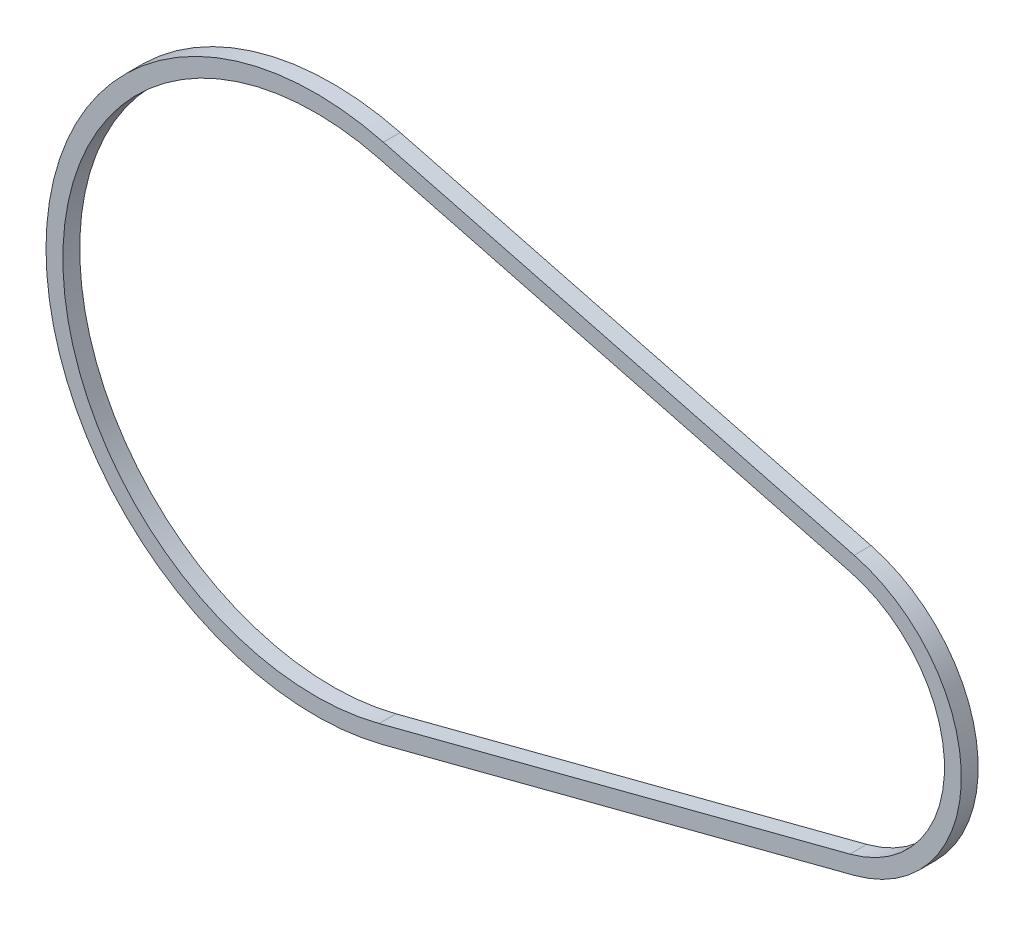
ISO-10303-21;
HEADER;
FILE_DESCRIPTION(('STEP AP214'),'2;1');
FILE_NAME('part.step','',(''),(''),'','','');
FILE_SCHEMA(('AUTOMOTIVE_DESIGN { 1 0 10303 214 1 1 1 1 }'));
ENDSEC;
DATA;
#1=APPLICATION_CONTEXT('core data for automotive mechanical design processes');
#2=APPLICATION_PROTOCOL_DEFINITION('international standard','automotive_design',2000,#1);
#3=PRODUCT_CONTEXT('',#1,'mechanical');
#4=PRODUCT('Part','Part','',(#3));
#5=PRODUCT_RELATED_PRODUCT_CATEGORY('part','',(#4));
#6=PRODUCT_DEFINITION_FORMATION('','',#4);
#7=PRODUCT_DEFINITION_CONTEXT('part definition',#1,'design');
#8=PRODUCT_DEFINITION('design','',#6,#7);
#9=PRODUCT_DEFINITION_SHAPE('','',#8);
#10=(LENGTH_UNIT() NAMED_UNIT(*) SI_UNIT(.MILLI.,.METRE.));
#11=(NAMED_UNIT(*) PLANE_ANGLE_UNIT() SI_UNIT($,.RADIAN.));
#12=(NAMED_UNIT(*) SI_UNIT($,.STERADIAN.) SOLID_ANGLE_UNIT());
#13=UNCERTAINTY_MEASURE_WITH_UNIT(LENGTH_MEASURE(1.E-05),#10,'distance_accuracy_value','');
#14=(GEOMETRIC_REPRESENTATION_CONTEXT(3) GLOBAL_UNCERTAINTY_ASSIGNED_CONTEXT((#13)) GLOBAL_UNIT_ASSIGNED_CONTEXT((#10,
#11,#12)) REPRESENTATION_CONTEXT('',''));
#15=CARTESIAN_POINT('',(0.,0.,0.));
#16=DIRECTION('',(0.,0.,1.));
#17=DIRECTION('',(1.,0.,0.));
#18=AXIS2_PLACEMENT_3D('',#15,#16,#17);
#19=CARTESIAN_POINT('',(0.,0.,10.));
#20=DIRECTION('',(0.,0.,1.));
#21=DIRECTION('',(1.,0.,0.));
#22=AXIS2_PLACEMENT_3D('',#19,#20,#21);
#23=PLANE('',#22);
#24=CARTESIAN_POINT('',(0.,0.,10.));
#25=DIRECTION('',(0.,0.,1.));
#26=DIRECTION('',(1.,0.,0.));
#27=AXIS2_PLACEMENT_3D('',#24,#25,#26);
#28=CIRCLE('',#27,160.);
#29=CARTESIAN_POINT('',(40.2360515021459,154.858193711268,10.));
#30=VERTEX_POINT('',#29);
#31=CARTESIAN_POINT('',(40.2360515021459,-154.858193711268,10.));
#32=VERTEX_POINT('',#31);
#33=EDGE_CURVE('E156',#30,#32,#28,.T.);
#34=ORIENTED_EDGE('',*,*,#33,.T.);
#35=DIRECTION('',(0.967863710695426,0.251475321888412,0.));
#36=VECTOR('',#35,1.);
#37=CARTESIAN_POINT('',(40.2360515021459,-154.858193711268,10.));
#38=LINE('',#37,#36);
#39=CARTESIAN_POINT('',(319.615402360515,-82.2684154091112,10.));
#40=VERTEX_POINT('',#39);
#41=EDGE_CURVE('E160',#32,#40,#38,.T.);
#42=ORIENTED_EDGE('',*,*,#41,.T.);
#43=CARTESIAN_POINT('',(298.24,0.,10.));
#44=DIRECTION('',(0.,0.,1.));
#45=DIRECTION('',(1.,0.,0.));
#46=AXIS2_PLACEMENT_3D('',#43,#44,#45);
#47=CIRCLE('',#46,85.);
#48=CARTESIAN_POINT('',(319.615402360515,82.2684154091112,10.));
#49=VERTEX_POINT('',#48);
#50=EDGE_CURVE('E164',#40,#49,#47,.T.);
#51=ORIENTED_EDGE('',*,*,#50,.T.);
#52=DIRECTION('',(-0.967863710695426,0.251475321888412,0.));
#53=VECTOR('',#52,1.);
#54=CARTESIAN_POINT('',(40.2360515021459,154.858193711268,10.));
#55=LINE('',#54,#53);
#56=EDGE_CURVE('E167',#49,#30,#55,.T.);
#57=ORIENTED_EDGE('',*,*,#56,.T.);
#58=EDGE_LOOP('',(#34,#42,#51,#57));
#59=FACE_BOUND('',#58,.T.);
#60=DIRECTION('',(0.967863710695426,0.251475321888412,0.));
#61=VECTOR('',#60,1.);
#62=CARTESIAN_POINT('',(37.7212982832618,-145.179556604314,10.));
#63=LINE('',#62,#61);
#64=CARTESIAN_POINT('',(37.7212982832618,-145.179556604314,10.));
#65=VERTEX_POINT('',#64);
#66=CARTESIAN_POINT('',(317.100649141631,-72.589778302157,10.));
#67=VERTEX_POINT('',#66);
#68=EDGE_CURVE('E117',#65,#67,#63,.T.);
#69=ORIENTED_EDGE('',*,*,#68,.F.);
#70=CARTESIAN_POINT('',(0.,0.,10.));
#71=DIRECTION('',(0.,0.,1.));
#72=DIRECTION('',(1.,0.,0.));
#73=AXIS2_PLACEMENT_3D('',#70,#71,#72);
#74=CIRCLE('',#73,150.);
#75=CARTESIAN_POINT('',(37.7212982832618,145.179556604314,10.));
#76=VERTEX_POINT('',#75);
#77=EDGE_CURVE('E108',#76,#65,#74,.T.);
#78=ORIENTED_EDGE('',*,*,#77,.F.);
#79=DIRECTION('',(-0.967863710695426,0.251475321888412,0.));
#80=VECTOR('',#79,1.);
#81=CARTESIAN_POINT('',(37.7212982832618,145.179556604314,10.));
#82=LINE('',#81,#80);
#83=CARTESIAN_POINT('',(317.100649141631,72.5897783021569,10.));
#84=VERTEX_POINT('',#83);
#85=EDGE_CURVE('E134',#84,#76,#82,.T.);
#86=ORIENTED_EDGE('',*,*,#85,.F.);
#87=CARTESIAN_POINT('',(298.24,0.,10.));
#88=DIRECTION('',(0.,0.,1.));
#89=DIRECTION('',(1.,0.,0.));
#90=AXIS2_PLACEMENT_3D('',#87,#88,#89);
#91=CIRCLE('',#90,75.);
#92=EDGE_CURVE('E130',#67,#84,#91,.T.);
#93=ORIENTED_EDGE('',*,*,#92,.F.);
#94=EDGE_LOOP('',(#69,#78,#86,#93));
#95=FACE_BOUND('',#94,.T.);
#96=ADVANCED_FACE('F42',(#59,#95),#23,.T.);
#97=CARTESIAN_POINT('',(0.,0.,0.));
#98=DIRECTION('',(0.,0.,1.));
#99=DIRECTION('',(1.,0.,0.));
#100=AXIS2_PLACEMENT_3D('',#97,#98,#99);
#101=PLANE('',#100);
#102=CARTESIAN_POINT('',(0.,0.,0.));
#103=DIRECTION('',(0.,0.,1.));
#104=DIRECTION('',(1.,0.,0.));
#105=AXIS2_PLACEMENT_3D('',#102,#103,#104);
#106=CIRCLE('',#105,160.);
#107=CARTESIAN_POINT('',(40.2360515021459,154.858193711268,0.));
#108=VERTEX_POINT('',#107);
#109=CARTESIAN_POINT('',(40.2360515021459,-154.858193711268,0.));
#110=VERTEX_POINT('',#109);
#111=EDGE_CURVE('E126',#108,#110,#106,.T.);
#112=ORIENTED_EDGE('',*,*,#111,.F.);
#113=DIRECTION('',(-0.967863710695426,0.251475321888412,0.));
#114=VECTOR('',#113,1.);
#115=CARTESIAN_POINT('',(40.2360515021459,154.858193711268,0.));
#116=LINE('',#115,#114);
#117=CARTESIAN_POINT('',(319.615402360515,82.2684154091112,0.));
#118=VERTEX_POINT('',#117);
#119=EDGE_CURVE('E161',#118,#108,#116,.T.);
#120=ORIENTED_EDGE('',*,*,#119,.F.);
#121=CARTESIAN_POINT('',(298.24,0.,0.));
#122=DIRECTION('',(0.,0.,1.));
#123=DIRECTION('',(1.,0.,0.));
#124=AXIS2_PLACEMENT_3D('',#121,#122,#123);
#125=CIRCLE('',#124,85.);
#126=CARTESIAN_POINT('',(319.615402360515,-82.2684154091112,0.));
#127=VERTEX_POINT('',#126);
#128=EDGE_CURVE('E177',#127,#118,#125,.T.);
#129=ORIENTED_EDGE('',*,*,#128,.F.);
#130=DIRECTION('',(0.967863710695426,0.251475321888412,0.));
#131=VECTOR('',#130,1.);
#132=CARTESIAN_POINT('',(40.2360515021459,-154.858193711268,0.));
#133=LINE('',#132,#131);
#134=EDGE_CURVE('E174',#110,#127,#133,.T.);
#135=ORIENTED_EDGE('',*,*,#134,.F.);
#136=EDGE_LOOP('',(#112,#120,#129,#135));
#137=FACE_BOUND('',#136,.T.);
#138=CARTESIAN_POINT('',(0.,0.,0.));
#139=DIRECTION('',(0.,0.,1.));
#140=DIRECTION('',(1.,0.,0.));
#141=AXIS2_PLACEMENT_3D('',#138,#139,#140);
#142=CIRCLE('',#141,150.);
#143=CARTESIAN_POINT('',(37.7212982832618,145.179556604314,0.));
#144=VERTEX_POINT('',#143);
#145=CARTESIAN_POINT('',(37.7212982832618,-145.179556604314,0.));
#146=VERTEX_POINT('',#145);
#147=EDGE_CURVE('E66',#144,#146,#142,.T.);
#148=ORIENTED_EDGE('',*,*,#147,.T.);
#149=DIRECTION('',(0.967863710695426,0.251475321888412,0.));
#150=VECTOR('',#149,1.);
#151=CARTESIAN_POINT('',(37.7212982832618,-145.179556604314,0.));
#152=LINE('',#151,#150);
#153=CARTESIAN_POINT('',(317.100649141631,-72.589778302157,0.));
#154=VERTEX_POINT('',#153);
#155=EDGE_CURVE('E124',#146,#154,#152,.T.);
#156=ORIENTED_EDGE('',*,*,#155,.T.);
#157=CARTESIAN_POINT('',(298.24,0.,0.));
#158=DIRECTION('',(0.,0.,1.));
#159=DIRECTION('',(1.,0.,0.));
#160=AXIS2_PLACEMENT_3D('',#157,#158,#159);
#161=CIRCLE('',#160,75.);
#162=CARTESIAN_POINT('',(317.100649141631,72.5897783021569,0.));
#163=VERTEX_POINT('',#162);
#164=EDGE_CURVE('E143',#154,#163,#161,.T.);
#165=ORIENTED_EDGE('',*,*,#164,.T.);
#166=DIRECTION('',(-0.967863710695426,0.251475321888412,0.));
#167=VECTOR('',#166,1.);
#168=CARTESIAN_POINT('',(37.7212982832618,145.179556604314,0.));
#169=LINE('',#168,#167);
#170=EDGE_CURVE('E118',#163,#144,#169,.T.);
#171=ORIENTED_EDGE('',*,*,#170,.T.);
#172=EDGE_LOOP('',(#148,#156,#165,#171));
#173=FACE_BOUND('',#172,.T.);
#174=ADVANCED_FACE('F200',(#137,#173),#101,.F.);
#175=CARTESIAN_POINT('',(0.,0.,10.));
#176=DIRECTION('',(0.,0.,-1.));
#177=DIRECTION('',(-1.,0.,0.));
#178=AXIS2_PLACEMENT_3D('',#175,#176,#177);
#179=CYLINDRICAL_SURFACE('',#178,160.);
#180=ORIENTED_EDGE('',*,*,#111,.T.);
#181=DIRECTION('',(0.,0.,-1.));
#182=VECTOR('',#181,1.);
#183=CARTESIAN_POINT('',(40.2360515021459,-154.858193711268,10.));
#184=LINE('',#183,#182);
#185=EDGE_CURVE('E11',#32,#110,#184,.T.);
#186=ORIENTED_EDGE('',*,*,#185,.F.);
#187=ORIENTED_EDGE('',*,*,#33,.F.);
#188=DIRECTION('',(0.,0.,-1.));
#189=VECTOR('',#188,1.);
#190=CARTESIAN_POINT('',(40.2360515021459,154.858193711268,10.));
#191=LINE('',#190,#189);
#192=EDGE_CURVE('E170',#30,#108,#191,.T.);
#193=ORIENTED_EDGE('',*,*,#192,.T.);
#194=EDGE_LOOP('',(#180,#186,#187,#193));
#195=FACE_BOUND('',#194,.T.);
#196=ADVANCED_FACE('F44',(#195),#179,.T.);
#197=CARTESIAN_POINT('',(40.2360515021459,-154.858193711268,10.));
#198=DIRECTION('',(-0.251475321888412,0.967863710695426,0.));
#199=DIRECTION('',(-0.967863710695426,-0.251475321888412,0.));
#200=AXIS2_PLACEMENT_3D('',#197,#198,#199);
#201=PLANE('',#200);
#202=ORIENTED_EDGE('',*,*,#134,.T.);
#203=DIRECTION('',(0.,0.,-1.));
#204=VECTOR('',#203,1.);
#205=CARTESIAN_POINT('',(319.615402360515,-82.2684154091112,10.));
#206=LINE('',#205,#204);
#207=EDGE_CURVE('E51',#40,#127,#206,.T.);
#208=ORIENTED_EDGE('',*,*,#207,.F.);
#209=ORIENTED_EDGE('',*,*,#41,.F.);
#210=ORIENTED_EDGE('',*,*,#185,.T.);
#211=EDGE_LOOP('',(#202,#208,#209,#210));
#212=FACE_BOUND('',#211,.T.);
#213=ADVANCED_FACE('F210',(#212),#201,.F.);
#214=CARTESIAN_POINT('',(298.24,0.,10.));
#215=DIRECTION('',(0.,0.,-1.));
#216=DIRECTION('',(-1.,0.,0.));
#217=AXIS2_PLACEMENT_3D('',#214,#215,#216);
#218=CYLINDRICAL_SURFACE('',#217,85.);
#219=ORIENTED_EDGE('',*,*,#128,.T.);
#220=DIRECTION('',(0.,0.,-1.));
#221=VECTOR('',#220,1.);
#222=CARTESIAN_POINT('',(319.615402360515,82.2684154091112,10.));
#223=LINE('',#222,#221);
#224=EDGE_CURVE('E185',#49,#118,#223,.T.);
#225=ORIENTED_EDGE('',*,*,#224,.F.);
#226=ORIENTED_EDGE('',*,*,#50,.F.);
#227=ORIENTED_EDGE('',*,*,#207,.T.);
#228=EDGE_LOOP('',(#219,#225,#226,#227));
#229=FACE_BOUND('',#228,.T.);
#230=ADVANCED_FACE('F194',(#229),#218,.T.);
#231=CARTESIAN_POINT('',(40.2360515021459,154.858193711268,10.));
#232=DIRECTION('',(-0.251475321888412,-0.967863710695426,0.));
#233=DIRECTION('',(0.967863710695426,-0.251475321888412,0.));
#234=AXIS2_PLACEMENT_3D('',#231,#232,#233);
#235=PLANE('',#234);
#236=ORIENTED_EDGE('',*,*,#119,.T.);
#237=ORIENTED_EDGE('',*,*,#192,.F.);
#238=ORIENTED_EDGE('',*,*,#56,.F.);
#239=ORIENTED_EDGE('',*,*,#224,.T.);
#240=EDGE_LOOP('',(#236,#237,#238,#239));
#241=FACE_BOUND('',#240,.T.);
#242=ADVANCED_FACE('F204',(#241),#235,.F.);
#243=CARTESIAN_POINT('',(0.,0.,10.));
#244=DIRECTION('',(0.,0.,-1.));
#245=DIRECTION('',(-1.,0.,0.));
#246=AXIS2_PLACEMENT_3D('',#243,#244,#245);
#247=CYLINDRICAL_SURFACE('',#246,150.);
#248=ORIENTED_EDGE('',*,*,#147,.F.);
#249=DIRECTION('',(0.,0.,-1.));
#250=VECTOR('',#249,1.);
#251=CARTESIAN_POINT('',(37.7212982832618,145.179556604314,10.));
#252=LINE('',#251,#250);
#253=EDGE_CURVE('E112',#76,#144,#252,.T.);
#254=ORIENTED_EDGE('',*,*,#253,.F.);
#255=ORIENTED_EDGE('',*,*,#77,.T.);
#256=DIRECTION('',(0.,0.,-1.));
#257=VECTOR('',#256,1.);
#258=CARTESIAN_POINT('',(37.7212982832618,-145.179556604314,10.));
#259=LINE('',#258,#257);
#260=EDGE_CURVE('E111',#65,#146,#259,.T.);
#261=ORIENTED_EDGE('',*,*,#260,.T.);
#262=EDGE_LOOP('',(#248,#254,#255,#261));
#263=FACE_BOUND('',#262,.T.);
#264=ADVANCED_FACE('F110',(#263),#247,.F.);
#265=CARTESIAN_POINT('',(37.7212982832618,-145.179556604314,10.));
#266=DIRECTION('',(-0.251475321888412,0.967863710695426,0.));
#267=DIRECTION('',(-0.967863710695426,-0.251475321888412,0.));
#268=AXIS2_PLACEMENT_3D('',#265,#266,#267);
#269=PLANE('',#268);
#270=ORIENTED_EDGE('',*,*,#155,.F.);
#271=ORIENTED_EDGE('',*,*,#260,.F.);
#272=ORIENTED_EDGE('',*,*,#68,.T.);
#273=DIRECTION('',(0.,0.,-1.));
#274=VECTOR('',#273,1.);
#275=CARTESIAN_POINT('',(317.100649141631,-72.589778302157,10.));
#276=LINE('',#275,#274);
#277=EDGE_CURVE('E127',#67,#154,#276,.T.);
#278=ORIENTED_EDGE('',*,*,#277,.T.);
#279=EDGE_LOOP('',(#270,#271,#272,#278));
#280=FACE_BOUND('',#279,.T.);
#281=ADVANCED_FACE('F121',(#280),#269,.T.);
#282=CARTESIAN_POINT('',(298.24,0.,10.));
#283=DIRECTION('',(0.,0.,-1.));
#284=DIRECTION('',(-1.,0.,0.));
#285=AXIS2_PLACEMENT_3D('',#282,#283,#284);
#286=CYLINDRICAL_SURFACE('',#285,75.);
#287=ORIENTED_EDGE('',*,*,#164,.F.);
#288=ORIENTED_EDGE('',*,*,#277,.F.);
#289=ORIENTED_EDGE('',*,*,#92,.T.);
#290=DIRECTION('',(0.,0.,-1.));
#291=VECTOR('',#290,1.);
#292=CARTESIAN_POINT('',(317.100649141631,72.5897783021569,10.));
#293=LINE('',#292,#291);
#294=EDGE_CURVE('E58',#84,#163,#293,.T.);
#295=ORIENTED_EDGE('',*,*,#294,.T.);
#296=EDGE_LOOP('',(#287,#288,#289,#295));
#297=FACE_BOUND('',#296,.T.);
#298=ADVANCED_FACE('F233',(#297),#286,.F.);
#299=CARTESIAN_POINT('',(37.7212982832618,145.179556604314,10.));
#300=DIRECTION('',(-0.251475321888412,-0.967863710695426,0.));
#301=DIRECTION('',(0.967863710695426,-0.251475321888412,0.));
#302=AXIS2_PLACEMENT_3D('',#299,#300,#301);
#303=PLANE('',#302);
#304=ORIENTED_EDGE('',*,*,#170,.F.);
#305=ORIENTED_EDGE('',*,*,#294,.F.);
#306=ORIENTED_EDGE('',*,*,#85,.T.);
#307=ORIENTED_EDGE('',*,*,#253,.T.);
#308=EDGE_LOOP('',(#304,#305,#306,#307));
#309=FACE_BOUND('',#308,.T.);
#310=ADVANCED_FACE('F237',(#309),#303,.T.);
#311=CLOSED_SHELL('',(#96,#174,#196,#213,#230,#242,#264,#281,#298,#310));
#312=MANIFOLD_SOLID_BREP('B2',#311);
#313=ADVANCED_BREP_SHAPE_REPRESENTATION('',(#18,#312),#14);
#314=SHAPE_DEFINITION_REPRESENTATION(#9,#313);
ENDSEC;
END-ISO-10303-21;
